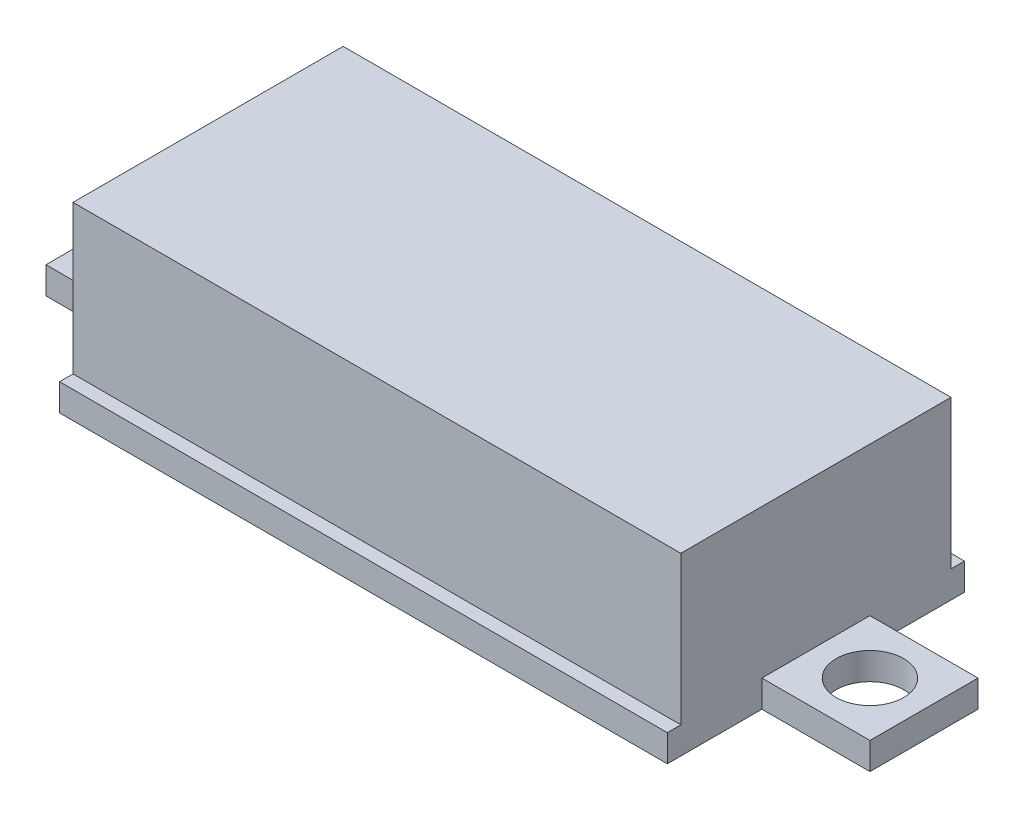
ISO-10303-21;
HEADER;
FILE_DESCRIPTION(('STEP AP214'),'2;1');
FILE_NAME('part.step','',(''),(''),'','','');
FILE_SCHEMA(('AUTOMOTIVE_DESIGN { 1 0 10303 214 1 1 1 1 }'));
ENDSEC;
DATA;
#1=APPLICATION_CONTEXT('core data for automotive mechanical design processes');
#2=APPLICATION_PROTOCOL_DEFINITION('international standard','automotive_design',2000,#1);
#3=PRODUCT_CONTEXT('',#1,'mechanical');
#4=PRODUCT('Part','Part','',(#3));
#5=PRODUCT_RELATED_PRODUCT_CATEGORY('part','',(#4));
#6=PRODUCT_DEFINITION_FORMATION('','',#4);
#7=PRODUCT_DEFINITION_CONTEXT('part definition',#1,'design');
#8=PRODUCT_DEFINITION('design','',#6,#7);
#9=PRODUCT_DEFINITION_SHAPE('','',#8);
#10=(LENGTH_UNIT() NAMED_UNIT(*) SI_UNIT(.MILLI.,.METRE.));
#11=(NAMED_UNIT(*) PLANE_ANGLE_UNIT() SI_UNIT($,.RADIAN.));
#12=(NAMED_UNIT(*) SI_UNIT($,.STERADIAN.) SOLID_ANGLE_UNIT());
#13=UNCERTAINTY_MEASURE_WITH_UNIT(LENGTH_MEASURE(1.E-05),#10,'distance_accuracy_value','');
#14=(GEOMETRIC_REPRESENTATION_CONTEXT(3) GLOBAL_UNCERTAINTY_ASSIGNED_CONTEXT((#13)) GLOBAL_UNIT_ASSIGNED_CONTEXT((#10,
#11,#12)) REPRESENTATION_CONTEXT('',''));
#15=CARTESIAN_POINT('',(0.,0.,0.));
#16=DIRECTION('',(0.,0.,1.));
#17=DIRECTION('',(1.,0.,0.));
#18=AXIS2_PLACEMENT_3D('',#15,#16,#17);
#19=CARTESIAN_POINT('',(0.,1.,0.));
#20=DIRECTION('',(0.,1.,0.));
#21=DIRECTION('',(0.,0.,1.));
#22=AXIS2_PLACEMENT_3D('',#19,#20,#21);
#23=PLANE('',#22);
#24=DIRECTION('',(0.,0.,-1.));
#25=VECTOR('',#24,1.);
#26=CARTESIAN_POINT('',(11.25,1.,-5.));
#27=LINE('',#26,#25);
#28=CARTESIAN_POINT('',(11.25,1.,1.99999999999999));
#29=VERTEX_POINT('',#28);
#30=CARTESIAN_POINT('',(11.25,1.,-1.99999999999999));
#31=VERTEX_POINT('',#30);
#32=EDGE_CURVE('E12',#29,#31,#27,.T.);
#33=ORIENTED_EDGE('',*,*,#32,.F.);
#34=DIRECTION('',(1.,0.,0.));
#35=VECTOR('',#34,1.);
#36=CARTESIAN_POINT('',(11.25,1.,1.99999999999999));
#37=LINE('',#36,#35);
#38=CARTESIAN_POINT('',(15.25,1.,1.99999999999999));
#39=VERTEX_POINT('',#38);
#40=EDGE_CURVE('E360',#29,#39,#37,.T.);
#41=ORIENTED_EDGE('',*,*,#40,.T.);
#42=DIRECTION('',(0.,0.,1.));
#43=VECTOR('',#42,1.);
#44=CARTESIAN_POINT('',(15.25,1.,-2.00000000000001));
#45=LINE('',#44,#43);
#46=CARTESIAN_POINT('',(15.25,1.,-2.00000000000001));
#47=VERTEX_POINT('',#46);
#48=EDGE_CURVE('E354',#47,#39,#45,.T.);
#49=ORIENTED_EDGE('',*,*,#48,.F.);
#50=DIRECTION('',(1.,0.,0.));
#51=VECTOR('',#50,1.);
#52=CARTESIAN_POINT('',(11.25,1.,-1.99999999999999));
#53=LINE('',#52,#51);
#54=EDGE_CURVE('E324',#31,#47,#53,.T.);
#55=ORIENTED_EDGE('',*,*,#54,.F.);
#56=EDGE_LOOP('',(#33,#41,#49,#55));
#57=FACE_BOUND('',#56,.T.);
#58=CARTESIAN_POINT('',(13.25,1.,0.));
#59=DIRECTION('',(0.,1.,0.));
#60=DIRECTION('',(0.,0.,1.));
#61=AXIS2_PLACEMENT_3D('',#58,#59,#60);
#62=CIRCLE('',#61,1.25);
#63=CARTESIAN_POINT('',(13.25,1.,1.25));
#64=VERTEX_POINT('',#63);
#65=EDGE_CURVE('E276',#64,#64,#62,.T.);
#66=ORIENTED_EDGE('',*,*,#65,.F.);
#67=EDGE_LOOP('',(#66));
#68=FACE_BOUND('',#67,.T.);
#69=ADVANCED_FACE('F134',(#57,#68),#23,.T.);
#70=DIRECTION('',(1.,0.,0.));
#71=VECTOR('',#70,1.);
#72=CARTESIAN_POINT('',(-11.25,1.,5.));
#73=LINE('',#72,#71);
#74=CARTESIAN_POINT('',(-11.25,1.,5.));
#75=VERTEX_POINT('',#74);
#76=CARTESIAN_POINT('',(11.25,1.,5.));
#77=VERTEX_POINT('',#76);
#78=EDGE_CURVE('E155',#75,#77,#73,.T.);
#79=ORIENTED_EDGE('',*,*,#78,.F.);
#80=DIRECTION('',(0.,0.,1.));
#81=VECTOR('',#80,1.);
#82=CARTESIAN_POINT('',(-11.25,1.,0.));
#83=LINE('',#82,#81);
#84=CARTESIAN_POINT('',(-11.25,1.,5.50000000000001));
#85=VERTEX_POINT('',#84);
#86=EDGE_CURVE('E370',#75,#85,#83,.T.);
#87=ORIENTED_EDGE('',*,*,#86,.T.);
#88=DIRECTION('',(1.,0.,0.));
#89=VECTOR('',#88,1.);
#90=CARTESIAN_POINT('',(0.,1.,5.50000000000001));
#91=LINE('',#90,#89);
#92=CARTESIAN_POINT('',(11.25,1.,5.5));
#93=VERTEX_POINT('',#92);
#94=EDGE_CURVE('E374',#85,#93,#91,.T.);
#95=ORIENTED_EDGE('',*,*,#94,.T.);
#96=DIRECTION('',(0.,0.,1.));
#97=VECTOR('',#96,1.);
#98=CARTESIAN_POINT('',(11.25,1.,0.));
#99=LINE('',#98,#97);
#100=EDGE_CURVE('E151',#77,#93,#99,.T.);
#101=ORIENTED_EDGE('',*,*,#100,.F.);
#102=EDGE_LOOP('',(#79,#87,#95,#101));
#103=FACE_BOUND('',#102,.T.);
#104=ADVANCED_FACE('F444',(#103),#23,.T.);
#105=DIRECTION('',(0.,0.,1.));
#106=VECTOR('',#105,1.);
#107=CARTESIAN_POINT('',(-11.25,1.,-5.));
#108=LINE('',#107,#106);
#109=CARTESIAN_POINT('',(-11.25,1.,-1.99999999999999));
#110=VERTEX_POINT('',#109);
#111=CARTESIAN_POINT('',(-11.25,1.,1.99999999999999));
#112=VERTEX_POINT('',#111);
#113=EDGE_CURVE('E143',#110,#112,#108,.T.);
#114=ORIENTED_EDGE('',*,*,#113,.F.);
#115=DIRECTION('',(-1.,0.,0.));
#116=VECTOR('',#115,1.);
#117=CARTESIAN_POINT('',(-11.25,1.,-1.99999999999999));
#118=LINE('',#117,#116);
#119=CARTESIAN_POINT('',(-15.25,1.,-2.));
#120=VERTEX_POINT('',#119);
#121=EDGE_CURVE('E338',#110,#120,#118,.T.);
#122=ORIENTED_EDGE('',*,*,#121,.T.);
#123=DIRECTION('',(0.,0.,1.));
#124=VECTOR('',#123,1.);
#125=CARTESIAN_POINT('',(-15.25,1.,-2.));
#126=LINE('',#125,#124);
#127=CARTESIAN_POINT('',(-15.25,1.,2.));
#128=VERTEX_POINT('',#127);
#129=EDGE_CURVE('E332',#120,#128,#126,.T.);
#130=ORIENTED_EDGE('',*,*,#129,.T.);
#131=DIRECTION('',(-1.,0.,0.));
#132=VECTOR('',#131,1.);
#133=CARTESIAN_POINT('',(-11.25,1.,1.99999999999999));
#134=LINE('',#133,#132);
#135=EDGE_CURVE('E328',#112,#128,#134,.T.);
#136=ORIENTED_EDGE('',*,*,#135,.F.);
#137=EDGE_LOOP('',(#114,#122,#130,#136));
#138=FACE_BOUND('',#137,.T.);
#139=CARTESIAN_POINT('',(-13.25,1.,0.));
#140=DIRECTION('',(0.,1.,0.));
#141=DIRECTION('',(0.,0.,1.));
#142=AXIS2_PLACEMENT_3D('',#139,#140,#141);
#143=CIRCLE('',#142,1.25);
#144=CARTESIAN_POINT('',(-13.25,1.,1.25));
#145=VERTEX_POINT('',#144);
#146=EDGE_CURVE('E349',#145,#145,#143,.T.);
#147=ORIENTED_EDGE('',*,*,#146,.F.);
#148=EDGE_LOOP('',(#147));
#149=FACE_BOUND('',#148,.T.);
#150=ADVANCED_FACE('F480',(#138,#149),#23,.T.);
#151=CARTESIAN_POINT('',(0.,1.,-5.5));
#152=DIRECTION('',(0.,0.,-1.));
#153=DIRECTION('',(-1.,0.,0.));
#154=AXIS2_PLACEMENT_3D('',#151,#152,#153);
#155=PLANE('',#154);
#156=DIRECTION('',(1.,0.,0.));
#157=VECTOR('',#156,1.);
#158=CARTESIAN_POINT('',(0.,0.,-5.5));
#159=LINE('',#158,#157);
#160=CARTESIAN_POINT('',(-11.25,0.,-5.5));
#161=VERTEX_POINT('',#160);
#162=CARTESIAN_POINT('',(11.25,0.,-5.5));
#163=VERTEX_POINT('',#162);
#164=EDGE_CURVE('E423',#161,#163,#159,.T.);
#165=ORIENTED_EDGE('',*,*,#164,.F.);
#166=DIRECTION('',(0.,-1.,0.));
#167=VECTOR('',#166,1.);
#168=CARTESIAN_POINT('',(-11.25,1.,-5.5));
#169=LINE('',#168,#167);
#170=CARTESIAN_POINT('',(-11.25,1.,-5.5));
#171=VERTEX_POINT('',#170);
#172=EDGE_CURVE('E436',#171,#161,#169,.T.);
#173=ORIENTED_EDGE('',*,*,#172,.F.);
#174=DIRECTION('',(1.,0.,0.));
#175=VECTOR('',#174,1.);
#176=CARTESIAN_POINT('',(0.,1.,-5.5));
#177=LINE('',#176,#175);
#178=CARTESIAN_POINT('',(11.25,1.,-5.5));
#179=VERTEX_POINT('',#178);
#180=EDGE_CURVE('E297',#171,#179,#177,.T.);
#181=ORIENTED_EDGE('',*,*,#180,.T.);
#182=DIRECTION('',(0.,-1.,0.));
#183=VECTOR('',#182,1.);
#184=CARTESIAN_POINT('',(11.25,1.,-5.5));
#185=LINE('',#184,#183);
#186=EDGE_CURVE('E385',#179,#163,#185,.T.);
#187=ORIENTED_EDGE('',*,*,#186,.T.);
#188=EDGE_LOOP('',(#165,#173,#181,#187));
#189=FACE_BOUND('',#188,.T.);
#190=ADVANCED_FACE('F489',(#189),#155,.T.);
#191=CARTESIAN_POINT('',(0.,1.,5.50000000000001));
#192=DIRECTION('',(0.,0.,-1.));
#193=DIRECTION('',(-1.,0.,0.));
#194=AXIS2_PLACEMENT_3D('',#191,#192,#193);
#195=PLANE('',#194);
#196=DIRECTION('',(1.,0.,0.));
#197=VECTOR('',#196,1.);
#198=CARTESIAN_POINT('',(0.,0.,5.50000000000001));
#199=LINE('',#198,#197);
#200=CARTESIAN_POINT('',(-11.25,0.,5.50000000000001));
#201=VERTEX_POINT('',#200);
#202=CARTESIAN_POINT('',(11.25,0.,5.5));
#203=VERTEX_POINT('',#202);
#204=EDGE_CURVE('E429',#201,#203,#199,.T.);
#205=ORIENTED_EDGE('',*,*,#204,.T.);
#206=DIRECTION('',(0.,-1.,0.));
#207=VECTOR('',#206,1.);
#208=CARTESIAN_POINT('',(11.25,1.,5.5));
#209=LINE('',#208,#207);
#210=EDGE_CURVE('E440',#93,#203,#209,.T.);
#211=ORIENTED_EDGE('',*,*,#210,.F.);
#212=ORIENTED_EDGE('',*,*,#94,.F.);
#213=DIRECTION('',(0.,-1.,0.));
#214=VECTOR('',#213,1.);
#215=CARTESIAN_POINT('',(-11.25,1.,5.50000000000001));
#216=LINE('',#215,#214);
#217=EDGE_CURVE('E438',#85,#201,#216,.T.);
#218=ORIENTED_EDGE('',*,*,#217,.T.);
#219=EDGE_LOOP('',(#205,#211,#212,#218));
#220=FACE_BOUND('',#219,.T.);
#221=ADVANCED_FACE('F447',(#220),#195,.F.);
#222=CARTESIAN_POINT('',(0.,0.,0.));
#223=DIRECTION('',(0.,1.,0.));
#224=DIRECTION('',(0.,0.,1.));
#225=AXIS2_PLACEMENT_3D('',#222,#223,#224);
#226=PLANE('',#225);
#227=DIRECTION('',(0.,0.,1.));
#228=VECTOR('',#227,1.);
#229=CARTESIAN_POINT('',(11.25,0.,0.));
#230=LINE('',#229,#228);
#231=CARTESIAN_POINT('',(11.25,0.,-1.99999999999999));
#232=VERTEX_POINT('',#231);
#233=EDGE_CURVE('E411',#163,#232,#230,.T.);
#234=ORIENTED_EDGE('',*,*,#233,.T.);
#235=DIRECTION('',(1.,0.,0.));
#236=VECTOR('',#235,1.);
#237=CARTESIAN_POINT('',(11.25,0.,-1.99999999999999));
#238=LINE('',#237,#236);
#239=CARTESIAN_POINT('',(15.25,0.,-2.00000000000001));
#240=VERTEX_POINT('',#239);
#241=EDGE_CURVE('E357',#232,#240,#238,.T.);
#242=ORIENTED_EDGE('',*,*,#241,.T.);
#243=DIRECTION('',(0.,0.,1.));
#244=VECTOR('',#243,1.);
#245=CARTESIAN_POINT('',(15.25,0.,-2.00000000000001));
#246=LINE('',#245,#244);
#247=CARTESIAN_POINT('',(15.25,0.,1.99999999999999));
#248=VERTEX_POINT('',#247);
#249=EDGE_CURVE('E319',#240,#248,#246,.T.);
#250=ORIENTED_EDGE('',*,*,#249,.T.);
#251=DIRECTION('',(1.,0.,0.));
#252=VECTOR('',#251,1.);
#253=CARTESIAN_POINT('',(11.25,0.,1.99999999999999));
#254=LINE('',#253,#252);
#255=CARTESIAN_POINT('',(11.25,0.,1.99999999999999));
#256=VERTEX_POINT('',#255);
#257=EDGE_CURVE('E366',#256,#248,#254,.T.);
#258=ORIENTED_EDGE('',*,*,#257,.F.);
#259=EDGE_CURVE('E306',#256,#203,#230,.T.);
#260=ORIENTED_EDGE('',*,*,#259,.T.);
#261=ORIENTED_EDGE('',*,*,#204,.F.);
#262=DIRECTION('',(0.,0.,1.));
#263=VECTOR('',#262,1.);
#264=CARTESIAN_POINT('',(-11.25,0.,0.));
#265=LINE('',#264,#263);
#266=CARTESIAN_POINT('',(-11.25,0.,1.99999999999999));
#267=VERTEX_POINT('',#266);
#268=EDGE_CURVE('E379',#267,#201,#265,.T.);
#269=ORIENTED_EDGE('',*,*,#268,.F.);
#270=DIRECTION('',(-1.,0.,0.));
#271=VECTOR('',#270,1.);
#272=CARTESIAN_POINT('',(-11.25,0.,1.99999999999999));
#273=LINE('',#272,#271);
#274=CARTESIAN_POINT('',(-15.25,0.,2.));
#275=VERTEX_POINT('',#274);
#276=EDGE_CURVE('E335',#267,#275,#273,.T.);
#277=ORIENTED_EDGE('',*,*,#276,.T.);
#278=DIRECTION('',(0.,0.,1.));
#279=VECTOR('',#278,1.);
#280=CARTESIAN_POINT('',(-15.25,0.,-2.));
#281=LINE('',#280,#279);
#282=CARTESIAN_POINT('',(-15.25,0.,-2.));
#283=VERTEX_POINT('',#282);
#284=EDGE_CURVE('E339',#283,#275,#281,.T.);
#285=ORIENTED_EDGE('',*,*,#284,.F.);
#286=DIRECTION('',(-1.,0.,0.));
#287=VECTOR('',#286,1.);
#288=CARTESIAN_POINT('',(-11.25,0.,-1.99999999999999));
#289=LINE('',#288,#287);
#290=CARTESIAN_POINT('',(-11.25,0.,-1.99999999999999));
#291=VERTEX_POINT('',#290);
#292=EDGE_CURVE('E346',#291,#283,#289,.T.);
#293=ORIENTED_EDGE('',*,*,#292,.F.);
#294=EDGE_CURVE('E432',#161,#291,#265,.T.);
#295=ORIENTED_EDGE('',*,*,#294,.F.);
#296=ORIENTED_EDGE('',*,*,#164,.T.);
#297=EDGE_LOOP('',(#234,#242,#250,#258,#260,#261,#269,#277,#285,#293,#295,#296));
#298=FACE_BOUND('',#297,.T.);
#299=CARTESIAN_POINT('',(-13.25,0.,0.));
#300=DIRECTION('',(0.,1.,0.));
#301=DIRECTION('',(0.,0.,1.));
#302=AXIS2_PLACEMENT_3D('',#299,#300,#301);
#303=CIRCLE('',#302,1.25);
#304=CARTESIAN_POINT('',(-13.25,0.,1.25));
#305=VERTEX_POINT('',#304);
#306=EDGE_CURVE('E325',#305,#305,#303,.T.);
#307=ORIENTED_EDGE('',*,*,#306,.T.);
#308=EDGE_LOOP('',(#307));
#309=FACE_BOUND('',#308,.T.);
#310=CARTESIAN_POINT('',(13.25,0.,0.));
#311=DIRECTION('',(0.,1.,0.));
#312=DIRECTION('',(0.,0.,1.));
#313=AXIS2_PLACEMENT_3D('',#310,#311,#312);
#314=CIRCLE('',#313,1.25);
#315=CARTESIAN_POINT('',(13.25,0.,1.25));
#316=VERTEX_POINT('',#315);
#317=EDGE_CURVE('E273',#316,#316,#314,.T.);
#318=ORIENTED_EDGE('',*,*,#317,.T.);
#319=EDGE_LOOP('',(#318));
#320=FACE_BOUND('',#319,.T.);
#321=ADVANCED_FACE('F419',(#298,#309,#320),#226,.F.);
#322=DIRECTION('',(-1.,0.,0.));
#323=VECTOR('',#322,1.);
#324=CARTESIAN_POINT('',(-11.25,1.,-5.));
#325=LINE('',#324,#323);
#326=CARTESIAN_POINT('',(11.25,1.,-5.));
#327=VERTEX_POINT('',#326);
#328=CARTESIAN_POINT('',(-11.25,1.,-5.));
#329=VERTEX_POINT('',#328);
#330=EDGE_CURVE('E287',#327,#329,#325,.T.);
#331=ORIENTED_EDGE('',*,*,#330,.F.);
#332=EDGE_CURVE('E272',#179,#327,#99,.T.);
#333=ORIENTED_EDGE('',*,*,#332,.F.);
#334=ORIENTED_EDGE('',*,*,#180,.F.);
#335=EDGE_CURVE('E371',#171,#329,#83,.T.);
#336=ORIENTED_EDGE('',*,*,#335,.T.);
#337=EDGE_LOOP('',(#331,#333,#334,#336));
#338=FACE_BOUND('',#337,.T.);
#339=ADVANCED_FACE('F476',(#338),#23,.T.);
#340=CARTESIAN_POINT('',(-11.25,1.,0.));
#341=DIRECTION('',(1.,0.,0.));
#342=DIRECTION('',(0.,0.,-1.));
#343=AXIS2_PLACEMENT_3D('',#340,#341,#342);
#344=PLANE('',#343);
#345=ORIENTED_EDGE('',*,*,#86,.F.);
#346=DIRECTION('',(0.,-1.,0.));
#347=VECTOR('',#346,1.);
#348=CARTESIAN_POINT('',(-11.25,6.5,5.));
#349=LINE('',#348,#347);
#350=CARTESIAN_POINT('',(-11.25,6.5,5.));
#351=VERTEX_POINT('',#350);
#352=EDGE_CURVE('E278',#351,#75,#349,.T.);
#353=ORIENTED_EDGE('',*,*,#352,.F.);
#354=DIRECTION('',(0.,0.,1.));
#355=VECTOR('',#354,1.);
#356=CARTESIAN_POINT('',(-11.25,6.5,-5.));
#357=LINE('',#356,#355);
#358=CARTESIAN_POINT('',(-11.25,6.5,-5.));
#359=VERTEX_POINT('',#358);
#360=EDGE_CURVE('E257',#359,#351,#357,.T.);
#361=ORIENTED_EDGE('',*,*,#360,.F.);
#362=DIRECTION('',(0.,-1.,0.));
#363=VECTOR('',#362,1.);
#364=CARTESIAN_POINT('',(-11.25,6.5,-5.));
#365=LINE('',#364,#363);
#366=EDGE_CURVE('E254',#359,#329,#365,.T.);
#367=ORIENTED_EDGE('',*,*,#366,.T.);
#368=ORIENTED_EDGE('',*,*,#335,.F.);
#369=ORIENTED_EDGE('',*,*,#172,.T.);
#370=ORIENTED_EDGE('',*,*,#294,.T.);
#371=DIRECTION('',(0.,-1.,0.));
#372=VECTOR('',#371,1.);
#373=CARTESIAN_POINT('',(-11.25,1.,-1.99999999999999));
#374=LINE('',#373,#372);
#375=EDGE_CURVE('E313',#110,#291,#374,.T.);
#376=ORIENTED_EDGE('',*,*,#375,.F.);
#377=ORIENTED_EDGE('',*,*,#113,.T.);
#378=DIRECTION('',(0.,-1.,0.));
#379=VECTOR('',#378,1.);
#380=CARTESIAN_POINT('',(-11.25,1.,1.99999999999999));
#381=LINE('',#380,#379);
#382=EDGE_CURVE('E382',#112,#267,#381,.T.);
#383=ORIENTED_EDGE('',*,*,#382,.T.);
#384=ORIENTED_EDGE('',*,*,#268,.T.);
#385=ORIENTED_EDGE('',*,*,#217,.F.);
#386=EDGE_LOOP('',(#345,#353,#361,#367,#368,#369,#370,#376,#377,#383,#384,#385));
#387=FACE_BOUND('',#386,.T.);
#388=ADVANCED_FACE('F461',(#387),#344,.F.);
#389=CARTESIAN_POINT('',(11.25,1.,0.));
#390=DIRECTION('',(1.,0.,0.));
#391=DIRECTION('',(0.,0.,-1.));
#392=AXIS2_PLACEMENT_3D('',#389,#390,#391);
#393=PLANE('',#392);
#394=DIRECTION('',(0.,-1.,0.));
#395=VECTOR('',#394,1.);
#396=CARTESIAN_POINT('',(11.25,1.,1.99999999999999));
#397=LINE('',#396,#395);
#398=EDGE_CURVE('E312',#29,#256,#397,.T.);
#399=ORIENTED_EDGE('',*,*,#398,.F.);
#400=ORIENTED_EDGE('',*,*,#32,.T.);
#401=DIRECTION('',(0.,-1.,0.));
#402=VECTOR('',#401,1.);
#403=CARTESIAN_POINT('',(11.25,1.,-1.99999999999999));
#404=LINE('',#403,#402);
#405=EDGE_CURVE('E309',#31,#232,#404,.T.);
#406=ORIENTED_EDGE('',*,*,#405,.T.);
#407=ORIENTED_EDGE('',*,*,#233,.F.);
#408=ORIENTED_EDGE('',*,*,#186,.F.);
#409=ORIENTED_EDGE('',*,*,#332,.T.);
#410=DIRECTION('',(0.,-1.,0.));
#411=VECTOR('',#410,1.);
#412=CARTESIAN_POINT('',(11.25,6.5,-5.));
#413=LINE('',#412,#411);
#414=CARTESIAN_POINT('',(11.25,6.5,-5.));
#415=VERTEX_POINT('',#414);
#416=EDGE_CURVE('E252',#415,#327,#413,.T.);
#417=ORIENTED_EDGE('',*,*,#416,.F.);
#418=DIRECTION('',(0.,0.,-1.));
#419=VECTOR('',#418,1.);
#420=CARTESIAN_POINT('',(11.25,6.5,-5.));
#421=LINE('',#420,#419);
#422=CARTESIAN_POINT('',(11.25,6.5,5.));
#423=VERTEX_POINT('',#422);
#424=EDGE_CURVE('E258',#423,#415,#421,.T.);
#425=ORIENTED_EDGE('',*,*,#424,.F.);
#426=DIRECTION('',(0.,-1.,0.));
#427=VECTOR('',#426,1.);
#428=CARTESIAN_POINT('',(11.25,6.5,5.));
#429=LINE('',#428,#427);
#430=EDGE_CURVE('E288',#423,#77,#429,.T.);
#431=ORIENTED_EDGE('',*,*,#430,.T.);
#432=ORIENTED_EDGE('',*,*,#100,.T.);
#433=ORIENTED_EDGE('',*,*,#210,.T.);
#434=ORIENTED_EDGE('',*,*,#259,.F.);
#435=EDGE_LOOP('',(#399,#400,#406,#407,#408,#409,#417,#425,#431,#432,#433,#434));
#436=FACE_BOUND('',#435,.T.);
#437=ADVANCED_FACE('F270',(#436),#393,.T.);
#438=CARTESIAN_POINT('',(-13.25,1.,0.));
#439=DIRECTION('',(0.,-1.,0.));
#440=DIRECTION('',(0.,0.,-1.));
#441=AXIS2_PLACEMENT_3D('',#438,#439,#440);
#442=CYLINDRICAL_SURFACE('',#441,1.25);
#443=ORIENTED_EDGE('',*,*,#146,.T.);
#444=EDGE_LOOP('',(#443));
#445=FACE_BOUND('',#444,.T.);
#446=ORIENTED_EDGE('',*,*,#306,.F.);
#447=EDGE_LOOP('',(#446));
#448=FACE_BOUND('',#447,.T.);
#449=ADVANCED_FACE('F528',(#445,#448),#442,.F.);
#450=CARTESIAN_POINT('',(-15.25,1.,-2.));
#451=DIRECTION('',(1.,0.,0.));
#452=DIRECTION('',(0.,0.,-1.));
#453=AXIS2_PLACEMENT_3D('',#450,#451,#452);
#454=PLANE('',#453);
#455=ORIENTED_EDGE('',*,*,#284,.T.);
#456=DIRECTION('',(0.,-1.,0.));
#457=VECTOR('',#456,1.);
#458=CARTESIAN_POINT('',(-15.25,1.,2.));
#459=LINE('',#458,#457);
#460=EDGE_CURVE('E331',#128,#275,#459,.T.);
#461=ORIENTED_EDGE('',*,*,#460,.F.);
#462=ORIENTED_EDGE('',*,*,#129,.F.);
#463=DIRECTION('',(0.,-1.,0.));
#464=VECTOR('',#463,1.);
#465=CARTESIAN_POINT('',(-15.25,1.,-2.));
#466=LINE('',#465,#464);
#467=EDGE_CURVE('E392',#120,#283,#466,.T.);
#468=ORIENTED_EDGE('',*,*,#467,.T.);
#469=EDGE_LOOP('',(#455,#461,#462,#468));
#470=FACE_BOUND('',#469,.T.);
#471=ADVANCED_FACE('F509',(#470),#454,.F.);
#472=CARTESIAN_POINT('',(-11.25,1.,1.99999999999999));
#473=DIRECTION('',(0.,0.,1.));
#474=DIRECTION('',(1.,0.,0.));
#475=AXIS2_PLACEMENT_3D('',#472,#473,#474);
#476=PLANE('',#475);
#477=ORIENTED_EDGE('',*,*,#276,.F.);
#478=ORIENTED_EDGE('',*,*,#382,.F.);
#479=ORIENTED_EDGE('',*,*,#135,.T.);
#480=ORIENTED_EDGE('',*,*,#460,.T.);
#481=EDGE_LOOP('',(#477,#478,#479,#480));
#482=FACE_BOUND('',#481,.T.);
#483=ADVANCED_FACE('F514',(#482),#476,.T.);
#484=CARTESIAN_POINT('',(-11.25,1.,-1.99999999999999));
#485=DIRECTION('',(0.,0.,1.));
#486=DIRECTION('',(1.,0.,0.));
#487=AXIS2_PLACEMENT_3D('',#484,#485,#486);
#488=PLANE('',#487);
#489=ORIENTED_EDGE('',*,*,#292,.T.);
#490=ORIENTED_EDGE('',*,*,#467,.F.);
#491=ORIENTED_EDGE('',*,*,#121,.F.);
#492=ORIENTED_EDGE('',*,*,#375,.T.);
#493=EDGE_LOOP('',(#489,#490,#491,#492));
#494=FACE_BOUND('',#493,.T.);
#495=ADVANCED_FACE('F517',(#494),#488,.F.);
#496=CARTESIAN_POINT('',(13.25,1.,0.));
#497=DIRECTION('',(0.,-1.,0.));
#498=DIRECTION('',(0.,0.,-1.));
#499=AXIS2_PLACEMENT_3D('',#496,#497,#498);
#500=CYLINDRICAL_SURFACE('',#499,1.25);
#501=ORIENTED_EDGE('',*,*,#65,.T.);
#502=EDGE_LOOP('',(#501));
#503=FACE_BOUND('',#502,.T.);
#504=ORIENTED_EDGE('',*,*,#317,.F.);
#505=EDGE_LOOP('',(#504));
#506=FACE_BOUND('',#505,.T.);
#507=ADVANCED_FACE('F473',(#503,#506),#500,.F.);
#508=CARTESIAN_POINT('',(15.25,1.,-2.00000000000001));
#509=DIRECTION('',(1.,0.,0.));
#510=DIRECTION('',(0.,0.,-1.));
#511=AXIS2_PLACEMENT_3D('',#508,#509,#510);
#512=PLANE('',#511);
#513=ORIENTED_EDGE('',*,*,#249,.F.);
#514=DIRECTION('',(0.,-1.,0.));
#515=VECTOR('',#514,1.);
#516=CARTESIAN_POINT('',(15.25,1.,-2.00000000000001));
#517=LINE('',#516,#515);
#518=EDGE_CURVE('E321',#47,#240,#517,.T.);
#519=ORIENTED_EDGE('',*,*,#518,.F.);
#520=ORIENTED_EDGE('',*,*,#48,.T.);
#521=DIRECTION('',(0.,-1.,0.));
#522=VECTOR('',#521,1.);
#523=CARTESIAN_POINT('',(15.25,1.,1.99999999999999));
#524=LINE('',#523,#522);
#525=EDGE_CURVE('E323',#39,#248,#524,.T.);
#526=ORIENTED_EDGE('',*,*,#525,.T.);
#527=EDGE_LOOP('',(#513,#519,#520,#526));
#528=FACE_BOUND('',#527,.T.);
#529=ADVANCED_FACE('F400',(#528),#512,.T.);
#530=CARTESIAN_POINT('',(11.25,1.,-1.99999999999999));
#531=DIRECTION('',(0.,0.,-1.));
#532=DIRECTION('',(-1.,0.,0.));
#533=AXIS2_PLACEMENT_3D('',#530,#531,#532);
#534=PLANE('',#533);
#535=ORIENTED_EDGE('',*,*,#241,.F.);
#536=ORIENTED_EDGE('',*,*,#405,.F.);
#537=ORIENTED_EDGE('',*,*,#54,.T.);
#538=ORIENTED_EDGE('',*,*,#518,.T.);
#539=EDGE_LOOP('',(#535,#536,#537,#538));
#540=FACE_BOUND('',#539,.T.);
#541=ADVANCED_FACE('F408',(#540),#534,.T.);
#542=CARTESIAN_POINT('',(11.25,1.,1.99999999999999));
#543=DIRECTION('',(0.,0.,-1.));
#544=DIRECTION('',(-1.,0.,0.));
#545=AXIS2_PLACEMENT_3D('',#542,#543,#544);
#546=PLANE('',#545);
#547=ORIENTED_EDGE('',*,*,#257,.T.);
#548=ORIENTED_EDGE('',*,*,#525,.F.);
#549=ORIENTED_EDGE('',*,*,#40,.F.);
#550=ORIENTED_EDGE('',*,*,#398,.T.);
#551=EDGE_LOOP('',(#547,#548,#549,#550));
#552=FACE_BOUND('',#551,.T.);
#553=ADVANCED_FACE('F136',(#552),#546,.F.);
#554=CARTESIAN_POINT('',(-11.25,6.5,-5.));
#555=DIRECTION('',(0.,0.,1.));
#556=DIRECTION('',(1.,0.,0.));
#557=AXIS2_PLACEMENT_3D('',#554,#555,#556);
#558=PLANE('',#557);
#559=ORIENTED_EDGE('',*,*,#330,.T.);
#560=ORIENTED_EDGE('',*,*,#366,.F.);
#561=DIRECTION('',(-1.,0.,0.));
#562=VECTOR('',#561,1.);
#563=CARTESIAN_POINT('',(-11.25,6.5,-5.));
#564=LINE('',#563,#562);
#565=EDGE_CURVE('E247',#415,#359,#564,.T.);
#566=ORIENTED_EDGE('',*,*,#565,.F.);
#567=ORIENTED_EDGE('',*,*,#416,.T.);
#568=EDGE_LOOP('',(#559,#560,#566,#567));
#569=FACE_BOUND('',#568,.T.);
#570=ADVANCED_FACE('F250',(#569),#558,.F.);
#571=CARTESIAN_POINT('',(-11.25,6.5,5.));
#572=DIRECTION('',(0.,0.,-1.));
#573=DIRECTION('',(-1.,0.,0.));
#574=AXIS2_PLACEMENT_3D('',#571,#572,#573);
#575=PLANE('',#574);
#576=ORIENTED_EDGE('',*,*,#78,.T.);
#577=ORIENTED_EDGE('',*,*,#430,.F.);
#578=DIRECTION('',(1.,0.,0.));
#579=VECTOR('',#578,1.);
#580=CARTESIAN_POINT('',(-11.25,6.5,5.));
#581=LINE('',#580,#579);
#582=EDGE_CURVE('E263',#351,#423,#581,.T.);
#583=ORIENTED_EDGE('',*,*,#582,.F.);
#584=ORIENTED_EDGE('',*,*,#352,.T.);
#585=EDGE_LOOP('',(#576,#577,#583,#584));
#586=FACE_BOUND('',#585,.T.);
#587=ADVANCED_FACE('F464',(#586),#575,.F.);
#588=CARTESIAN_POINT('',(0.,6.5,0.));
#589=DIRECTION('',(0.,1.,0.));
#590=DIRECTION('',(0.,0.,1.));
#591=AXIS2_PLACEMENT_3D('',#588,#589,#590);
#592=PLANE('',#591);
#593=ORIENTED_EDGE('',*,*,#424,.T.);
#594=ORIENTED_EDGE('',*,*,#565,.T.);
#595=ORIENTED_EDGE('',*,*,#360,.T.);
#596=ORIENTED_EDGE('',*,*,#582,.T.);
#597=EDGE_LOOP('',(#593,#594,#595,#596));
#598=FACE_BOUND('',#597,.T.);
#599=ADVANCED_FACE('F261',(#598),#592,.T.);
#600=CLOSED_SHELL('',(#69,#104,#150,#190,#221,#321,#339,#388,#437,#449,#471,#483,#495,#507,#529,
#541,#553,#570,#587,#599));
#601=MANIFOLD_SOLID_BREP('B2',#600);
#602=ADVANCED_BREP_SHAPE_REPRESENTATION('',(#18,#601),#14);
#603=SHAPE_DEFINITION_REPRESENTATION(#9,#602);
ENDSEC;
END-ISO-10303-21;
